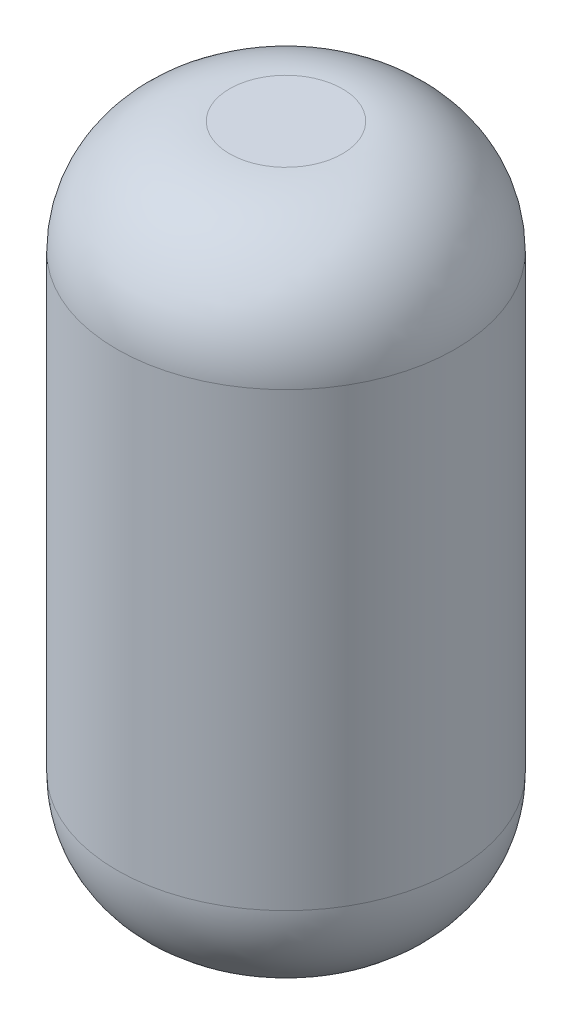
ISO-10303-21;
HEADER;
FILE_DESCRIPTION(('STEP AP214'),'2;1');
FILE_NAME('part.step','',(''),(''),'','','');
FILE_SCHEMA(('AUTOMOTIVE_DESIGN { 1 0 10303 214 1 1 1 1 }'));
ENDSEC;
DATA;
#1=APPLICATION_CONTEXT('core data for automotive mechanical design processes');
#2=APPLICATION_PROTOCOL_DEFINITION('international standard','automotive_design',2000,#1);
#3=PRODUCT_CONTEXT('',#1,'mechanical');
#4=PRODUCT('Part','Part','',(#3));
#5=PRODUCT_RELATED_PRODUCT_CATEGORY('part','',(#4));
#6=PRODUCT_DEFINITION_FORMATION('','',#4);
#7=PRODUCT_DEFINITION_CONTEXT('part definition',#1,'design');
#8=PRODUCT_DEFINITION('design','',#6,#7);
#9=PRODUCT_DEFINITION_SHAPE('','',#8);
#10=(LENGTH_UNIT() NAMED_UNIT(*) SI_UNIT(.MILLI.,.METRE.));
#11=(NAMED_UNIT(*) PLANE_ANGLE_UNIT() SI_UNIT($,.RADIAN.));
#12=(NAMED_UNIT(*) SI_UNIT($,.STERADIAN.) SOLID_ANGLE_UNIT());
#13=UNCERTAINTY_MEASURE_WITH_UNIT(LENGTH_MEASURE(1.E-05),#10,'distance_accuracy_value','');
#14=(GEOMETRIC_REPRESENTATION_CONTEXT(3) GLOBAL_UNCERTAINTY_ASSIGNED_CONTEXT((#13)) GLOBAL_UNIT_ASSIGNED_CONTEXT((#10,
#11,#12)) REPRESENTATION_CONTEXT('',''));
#15=CARTESIAN_POINT('',(0.,0.,0.));
#16=DIRECTION('',(0.,0.,1.));
#17=DIRECTION('',(1.,0.,0.));
#18=AXIS2_PLACEMENT_3D('',#15,#16,#17);
#19=CARTESIAN_POINT('',(0.,38.1,0.));
#20=DIRECTION('',(0.,-1.,0.));
#21=DIRECTION('',(0.,0.,-1.));
#22=AXIS2_PLACEMENT_3D('',#19,#20,#21);
#23=CYLINDRICAL_SURFACE('',#22,9.525);
#24=CARTESIAN_POINT('',(0.,31.75,0.));
#25=DIRECTION('',(0.,1.,0.));
#26=DIRECTION('',(0.,0.,1.));
#27=AXIS2_PLACEMENT_3D('',#24,#25,#26);
#28=CIRCLE('',#27,9.525);
#29=CARTESIAN_POINT('',(0.,31.75,-9.525));
#30=VERTEX_POINT('',#29);
#31=EDGE_CURVE('E46',#30,#30,#28,.F.);
#32=CARTESIAN_POINT('',(0.,6.34999999999997,0.));
#33=DIRECTION('',(0.,1.,0.));
#34=DIRECTION('',(0.,0.,1.));
#35=AXIS2_PLACEMENT_3D('',#32,#33,#34);
#36=CIRCLE('',#35,9.525);
#37=CARTESIAN_POINT('',(0.,6.34999999999997,-9.525));
#38=VERTEX_POINT('',#37);
#39=EDGE_CURVE('E50',#38,#38,#36,.T.);
#40=CARTESIAN_POINT('',(0.,31.75,-9.525));
#41=CARTESIAN_POINT('',(0.,31.4854166666667,-9.525));
#42=CARTESIAN_POINT('',(0.,31.2208333333333,-9.525));
#43=CARTESIAN_POINT('',(0.,30.6916666666667,-9.525));
#44=CARTESIAN_POINT('',(0.,30.4270833333333,-9.525));
#45=CARTESIAN_POINT('',(0.,29.8979166666667,-9.525));
#46=CARTESIAN_POINT('',(0.,29.6333333333333,-9.525));
#47=CARTESIAN_POINT('',(0.,29.1041666666667,-9.525));
#48=CARTESIAN_POINT('',(0.,28.8395833333333,-9.525));
#49=CARTESIAN_POINT('',(0.,28.3104166666667,-9.525));
#50=CARTESIAN_POINT('',(0.,28.0458333333333,-9.525));
#51=CARTESIAN_POINT('',(0.,27.5166666666667,-9.525));
#52=CARTESIAN_POINT('',(0.,27.2520833333333,-9.525));
#53=CARTESIAN_POINT('',(0.,26.7229166666667,-9.525));
#54=CARTESIAN_POINT('',(0.,26.4583333333333,-9.525));
#55=CARTESIAN_POINT('',(0.,25.9291666666667,-9.525));
#56=CARTESIAN_POINT('',(0.,25.6645833333333,-9.525));
#57=CARTESIAN_POINT('',(0.,25.1354166666667,-9.525));
#58=CARTESIAN_POINT('',(0.,24.8708333333333,-9.525));
#59=CARTESIAN_POINT('',(0.,24.3416666666667,-9.525));
#60=CARTESIAN_POINT('',(0.,24.0770833333333,-9.525));
#61=CARTESIAN_POINT('',(0.,23.5479166666667,-9.525));
#62=CARTESIAN_POINT('',(0.,23.2833333333333,-9.525));
#63=CARTESIAN_POINT('',(0.,22.7541666666667,-9.525));
#64=CARTESIAN_POINT('',(0.,22.4895833333333,-9.525));
#65=CARTESIAN_POINT('',(0.,21.9604166666667,-9.525));
#66=CARTESIAN_POINT('',(0.,21.6958333333333,-9.525));
#67=CARTESIAN_POINT('',(0.,21.1666666666667,-9.525));
#68=CARTESIAN_POINT('',(0.,20.9020833333333,-9.525));
#69=CARTESIAN_POINT('',(0.,20.3729166666667,-9.525));
#70=CARTESIAN_POINT('',(0.,20.1083333333333,-9.525));
#71=CARTESIAN_POINT('',(0.,19.5791666666666,-9.525));
#72=CARTESIAN_POINT('',(0.,19.3145833333333,-9.525));
#73=CARTESIAN_POINT('',(0.,18.7854166666666,-9.525));
#74=CARTESIAN_POINT('',(0.,18.5208333333333,-9.525));
#75=CARTESIAN_POINT('',(0.,17.9916666666666,-9.525));
#76=CARTESIAN_POINT('',(0.,17.7270833333333,-9.525));
#77=CARTESIAN_POINT('',(0.,17.1979166666666,-9.525));
#78=CARTESIAN_POINT('',(0.,16.9333333333333,-9.525));
#79=CARTESIAN_POINT('',(0.,16.4041666666666,-9.525));
#80=CARTESIAN_POINT('',(0.,16.1395833333333,-9.525));
#81=CARTESIAN_POINT('',(0.,15.6104166666666,-9.525));
#82=CARTESIAN_POINT('',(0.,15.3458333333333,-9.525));
#83=CARTESIAN_POINT('',(0.,14.8166666666666,-9.525));
#84=CARTESIAN_POINT('',(0.,14.5520833333333,-9.525));
#85=CARTESIAN_POINT('',(0.,14.0229166666666,-9.525));
#86=CARTESIAN_POINT('',(0.,13.7583333333333,-9.525));
#87=CARTESIAN_POINT('',(0.,13.2291666666666,-9.525));
#88=CARTESIAN_POINT('',(0.,12.9645833333333,-9.525));
#89=CARTESIAN_POINT('',(0.,12.4354166666666,-9.525));
#90=CARTESIAN_POINT('',(0.,12.1708333333333,-9.525));
#91=CARTESIAN_POINT('',(0.,11.6416666666666,-9.525));
#92=CARTESIAN_POINT('',(0.,11.3770833333333,-9.525));
#93=CARTESIAN_POINT('',(0.,10.8479166666666,-9.525));
#94=CARTESIAN_POINT('',(0.,10.5833333333333,-9.525));
#95=CARTESIAN_POINT('',(0.,10.0541666666666,-9.525));
#96=CARTESIAN_POINT('',(0.,9.7895833333333,-9.525));
#97=CARTESIAN_POINT('',(0.,9.26041666666663,-9.525));
#98=CARTESIAN_POINT('',(0.,8.9958333333333,-9.525));
#99=CARTESIAN_POINT('',(0.,8.46666666666663,-9.525));
#100=CARTESIAN_POINT('',(0.,8.2020833333333,-9.525));
#101=CARTESIAN_POINT('',(0.,7.67291666666663,-9.525));
#102=CARTESIAN_POINT('',(0.,7.4083333333333,-9.525));
#103=CARTESIAN_POINT('',(0.,6.87916666666663,-9.525));
#104=CARTESIAN_POINT('',(0.,6.6145833333333,-9.525));
#105=CARTESIAN_POINT('',(0.,6.34999999999997,-9.525));
#106=B_SPLINE_CURVE_WITH_KNOTS('',3,(#40,#41,#42,#43,#44,#45,#46,#47,#48,#49,#50,#51,#52,#53,
#54,#55,#56,#57,#58,#59,#60,#61,#62,#63,#64,#65,#66,#67,#68,#69,#70,#71,#72,#73,#74,#75,#76,#77,
#78,#79,#80,#81,#82,#83,#84,#85,#86,#87,#88,#89,#90,#91,#92,#93,#94,#95,#96,#97,#98,#99,#100,
#101,#102,#103,#104,#105),.UNSPECIFIED.,.F.,.F.,(4,2,2,2,2,2,2,2,2,2,2,2,2,2,2,2,2,2,2,2,2,2,2,
2,2,2,2,2,2,2,2,2,4),(0.,0.793749999999999,1.5875,2.38125,3.175,3.96875,4.7625,5.55625000000001,
6.35,7.14375,7.93750000000001,8.73125000000001,9.52500000000001,10.31875,11.1125,11.90625,12.7,
13.49375,14.2875,15.08125,15.875,16.66875,17.4625,18.25625,19.05,19.84375,20.6375,21.43125,
22.225,23.01875,23.8125,24.60625,25.4),.UNSPECIFIED.);
#107=EDGE_CURVE('BSEAM39',#30,#38,#106,.T.);
#108=ORIENTED_EDGE('',*,*,#31,.T.);
#109=ORIENTED_EDGE('',*,*,#39,.T.);
#110=ORIENTED_EDGE('',*,*,#107,.T.);
#111=ORIENTED_EDGE('',*,*,#107,.F.);
#112=EDGE_LOOP('',(#108,#110,#109,#111));
#113=FACE_BOUND('',#112,.T.);
#114=ADVANCED_FACE('F39',(#113),#23,.T.);
#115=CARTESIAN_POINT('',(0.,38.1,0.));
#116=DIRECTION('',(0.,1.,0.));
#117=DIRECTION('',(0.,0.,1.));
#118=AXIS2_PLACEMENT_3D('',#115,#116,#117);
#119=PLANE('',#118);
#120=CARTESIAN_POINT('',(0.,38.1,0.));
#121=DIRECTION('',(0.,1.,0.));
#122=DIRECTION('',(0.,0.,1.));
#123=AXIS2_PLACEMENT_3D('',#120,#121,#122);
#124=CIRCLE('',#123,3.175);
#125=CARTESIAN_POINT('',(0.,38.1,3.175));
#126=VERTEX_POINT('',#125);
#127=EDGE_CURVE('E54',#126,#126,#124,.T.);
#128=ORIENTED_EDGE('',*,*,#127,.T.);
#129=EDGE_LOOP('',(#128));
#130=FACE_BOUND('',#129,.T.);
#131=ADVANCED_FACE('F60',(#130),#119,.T.);
#132=CARTESIAN_POINT('',(0.,0.,0.));
#133=DIRECTION('',(0.,1.,0.));
#134=DIRECTION('',(0.,0.,1.));
#135=AXIS2_PLACEMENT_3D('',#132,#133,#134);
#136=PLANE('',#135);
#137=CARTESIAN_POINT('',(0.,0.,0.));
#138=DIRECTION('',(0.,1.,0.));
#139=DIRECTION('',(0.,0.,1.));
#140=AXIS2_PLACEMENT_3D('',#137,#138,#139);
#141=CIRCLE('',#140,3.175);
#142=CARTESIAN_POINT('',(0.,0.,3.175));
#143=VERTEX_POINT('',#142);
#144=EDGE_CURVE('E10',#143,#143,#141,.F.);
#145=ORIENTED_EDGE('',*,*,#144,.T.);
#146=EDGE_LOOP('',(#145));
#147=FACE_BOUND('',#146,.T.);
#148=ADVANCED_FACE('F64',(#147),#136,.F.);
#149=CARTESIAN_POINT('',(0.,31.75,0.));
#150=DIRECTION('',(0.,1.,0.));
#151=DIRECTION('',(0.,0.,1.));
#152=AXIS2_PLACEMENT_3D('',#149,#150,#151);
#153=DEGENERATE_TOROIDAL_SURFACE('',#152,3.175,6.35,.T.);
#154=ORIENTED_EDGE('',*,*,#31,.F.);
#155=EDGE_LOOP('',(#154));
#156=FACE_BOUND('',#155,.T.);
#157=ORIENTED_EDGE('',*,*,#127,.F.);
#158=EDGE_LOOP('',(#157));
#159=FACE_BOUND('',#158,.T.);
#160=ADVANCED_FACE('F62',(#156,#159),#153,.T.);
#161=CARTESIAN_POINT('',(0.,6.35,0.));
#162=DIRECTION('',(0.,1.,0.));
#163=DIRECTION('',(0.,0.,1.));
#164=AXIS2_PLACEMENT_3D('',#161,#162,#163);
#165=DEGENERATE_TOROIDAL_SURFACE('',#164,3.175,6.35,.T.);
#166=ORIENTED_EDGE('',*,*,#144,.F.);
#167=EDGE_LOOP('',(#166));
#168=FACE_BOUND('',#167,.T.);
#169=ORIENTED_EDGE('',*,*,#39,.F.);
#170=EDGE_LOOP('',(#169));
#171=FACE_BOUND('',#170,.T.);
#172=ADVANCED_FACE('F41',(#168,#171),#165,.T.);
#173=CLOSED_SHELL('',(#114,#131,#148,#160,#172));
#174=MANIFOLD_SOLID_BREP('B2',#173);
#175=ADVANCED_BREP_SHAPE_REPRESENTATION('',(#18,#174),#14);
#176=SHAPE_DEFINITION_REPRESENTATION(#9,#175);
ENDSEC;
END-ISO-10303-21;
